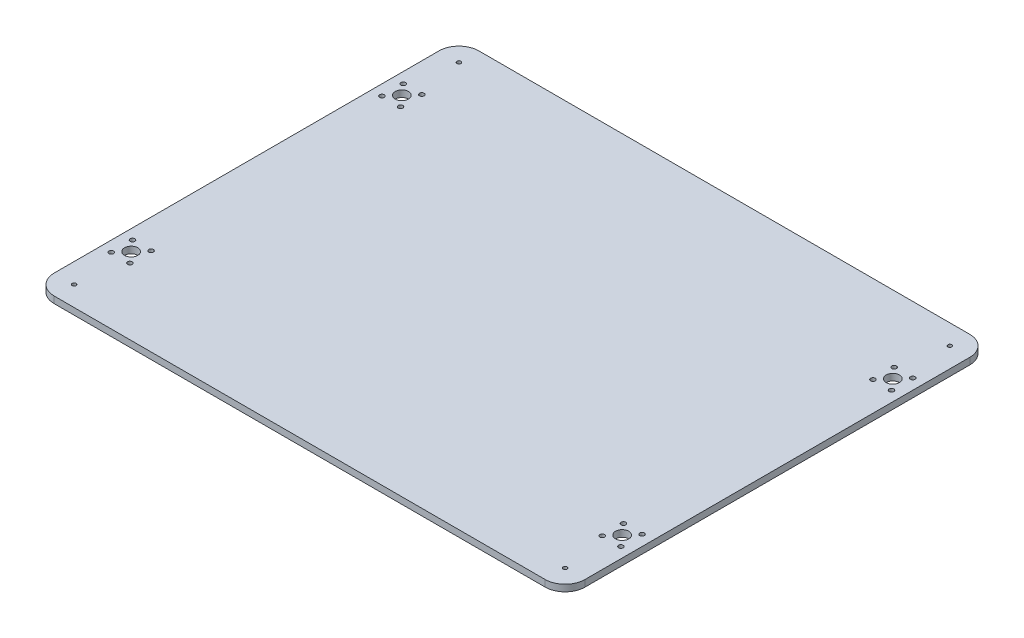
ISO-10303-21;
HEADER;
FILE_DESCRIPTION(('STEP AP214'),'2;1');
FILE_NAME('part.step','',(''),(''),'','','');
FILE_SCHEMA(('AUTOMOTIVE_DESIGN { 1 0 10303 214 1 1 1 1 }'));
ENDSEC;
DATA;
#1=APPLICATION_CONTEXT('core data for automotive mechanical design processes');
#2=APPLICATION_PROTOCOL_DEFINITION('international standard','automotive_design',2000,#1);
#3=PRODUCT_CONTEXT('',#1,'mechanical');
#4=PRODUCT('Part','Part','',(#3));
#5=PRODUCT_RELATED_PRODUCT_CATEGORY('part','',(#4));
#6=PRODUCT_DEFINITION_FORMATION('','',#4);
#7=PRODUCT_DEFINITION_CONTEXT('part definition',#1,'design');
#8=PRODUCT_DEFINITION('design','',#6,#7);
#9=PRODUCT_DEFINITION_SHAPE('','',#8);
#10=(LENGTH_UNIT() NAMED_UNIT(*) SI_UNIT(.MILLI.,.METRE.));
#11=(NAMED_UNIT(*) PLANE_ANGLE_UNIT() SI_UNIT($,.RADIAN.));
#12=(NAMED_UNIT(*) SI_UNIT($,.STERADIAN.) SOLID_ANGLE_UNIT());
#13=UNCERTAINTY_MEASURE_WITH_UNIT(LENGTH_MEASURE(1.E-05),#10,'distance_accuracy_value','');
#14=(GEOMETRIC_REPRESENTATION_CONTEXT(3) GLOBAL_UNCERTAINTY_ASSIGNED_CONTEXT((#13)) GLOBAL_UNIT_ASSIGNED_CONTEXT((#10,
#11,#12)) REPRESENTATION_CONTEXT('',''));
#15=CARTESIAN_POINT('',(0.,0.,0.));
#16=DIRECTION('',(0.,0.,1.));
#17=DIRECTION('',(1.,0.,0.));
#18=AXIS2_PLACEMENT_3D('',#15,#16,#17);
#19=CARTESIAN_POINT('',(0.,5.,0.));
#20=DIRECTION('',(0.,-1.,0.));
#21=DIRECTION('',(0.,0.,-1.));
#22=AXIS2_PLACEMENT_3D('',#19,#20,#21);
#23=PLANE('',#22);
#24=CARTESIAN_POINT('',(-185.,5.,-145.));
#25=DIRECTION('',(0.,1.,0.));
#26=DIRECTION('',(0.,0.,-1.));
#27=AXIS2_PLACEMENT_3D('',#24,#25,#26);
#28=CIRCLE('',#27,1.5);
#29=CARTESIAN_POINT('',(-185.,5.,-146.5));
#30=VERTEX_POINT('',#29);
#31=EDGE_CURVE('E385',#30,#30,#28,.T.);
#32=ORIENTED_EDGE('',*,*,#31,.F.);
#33=EDGE_LOOP('',(#32));
#34=FACE_BOUND('',#33,.T.);
#35=CARTESIAN_POINT('',(185.,5.,-145.));
#36=DIRECTION('',(0.,-1.,0.));
#37=DIRECTION('',(0.,0.,-1.));
#38=AXIS2_PLACEMENT_3D('',#35,#36,#37);
#39=CIRCLE('',#38,1.5);
#40=CARTESIAN_POINT('',(185.,5.,-146.5));
#41=VERTEX_POINT('',#40);
#42=EDGE_CURVE('E377',#41,#41,#39,.T.);
#43=ORIENTED_EDGE('',*,*,#42,.T.);
#44=EDGE_LOOP('',(#43));
#45=FACE_BOUND('',#44,.T.);
#46=CARTESIAN_POINT('',(-185.,5.,145.));
#47=DIRECTION('',(0.,-1.,0.));
#48=DIRECTION('',(0.,0.,1.));
#49=AXIS2_PLACEMENT_3D('',#46,#47,#48);
#50=CIRCLE('',#49,1.5);
#51=CARTESIAN_POINT('',(-185.,5.,146.5));
#52=VERTEX_POINT('',#51);
#53=EDGE_CURVE('E369',#52,#52,#50,.T.);
#54=ORIENTED_EDGE('',*,*,#53,.T.);
#55=EDGE_LOOP('',(#54));
#56=FACE_BOUND('',#55,.T.);
#57=CARTESIAN_POINT('',(185.,5.,145.));
#58=DIRECTION('',(0.,1.,0.));
#59=DIRECTION('',(0.,0.,1.));
#60=AXIS2_PLACEMENT_3D('',#57,#58,#59);
#61=CIRCLE('',#60,1.5);
#62=CARTESIAN_POINT('',(185.,5.,146.5));
#63=VERTEX_POINT('',#62);
#64=EDGE_CURVE('E361',#63,#63,#61,.T.);
#65=ORIENTED_EDGE('',*,*,#64,.F.);
#66=EDGE_LOOP('',(#65));
#67=FACE_BOUND('',#66,.T.);
#68=CARTESIAN_POINT('',(185.,5.,102.));
#69=DIRECTION('',(0.,1.,0.));
#70=DIRECTION('',(0.,0.,-1.));
#71=AXIS2_PLACEMENT_3D('',#68,#69,#70);
#72=CIRCLE('',#71,4.99999999999999);
#73=CARTESIAN_POINT('',(185.,5.,97.));
#74=VERTEX_POINT('',#73);
#75=EDGE_CURVE('E338',#74,#74,#72,.T.);
#76=ORIENTED_EDGE('',*,*,#75,.F.);
#77=EDGE_LOOP('',(#76));
#78=FACE_BOUND('',#77,.T.);
#79=CARTESIAN_POINT('',(178.,5.,110.));
#80=DIRECTION('',(0.,1.,0.));
#81=DIRECTION('',(0.,0.,-1.));
#82=AXIS2_PLACEMENT_3D('',#79,#80,#81);
#83=CIRCLE('',#82,1.75000000000001);
#84=CARTESIAN_POINT('',(178.,5.,108.25));
#85=VERTEX_POINT('',#84);
#86=EDGE_CURVE('E354',#85,#85,#83,.T.);
#87=ORIENTED_EDGE('',*,*,#86,.F.);
#88=EDGE_LOOP('',(#87));
#89=FACE_BOUND('',#88,.T.);
#90=CARTESIAN_POINT('',(192.,5.,110.));
#91=DIRECTION('',(0.,1.,0.));
#92=DIRECTION('',(0.,0.,-1.));
#93=AXIS2_PLACEMENT_3D('',#90,#91,#92);
#94=CIRCLE('',#93,1.75000000000001);
#95=CARTESIAN_POINT('',(192.,5.,108.25));
#96=VERTEX_POINT('',#95);
#97=EDGE_CURVE('E321',#96,#96,#94,.T.);
#98=ORIENTED_EDGE('',*,*,#97,.F.);
#99=EDGE_LOOP('',(#98));
#100=FACE_BOUND('',#99,.T.);
#101=CARTESIAN_POINT('',(178.,5.,-94.0000000000001));
#102=DIRECTION('',(0.,-1.,0.));
#103=DIRECTION('',(0.,0.,1.));
#104=AXIS2_PLACEMENT_3D('',#101,#102,#103);
#105=CIRCLE('',#104,1.75000000000001);
#106=CARTESIAN_POINT('',(178.,5.,-92.25));
#107=VERTEX_POINT('',#106);
#108=EDGE_CURVE('E306',#107,#107,#105,.F.);
#109=ORIENTED_EDGE('',*,*,#108,.F.);
#110=EDGE_LOOP('',(#109));
#111=FACE_BOUND('',#110,.T.);
#112=CARTESIAN_POINT('',(178.,5.,-110.));
#113=DIRECTION('',(0.,-1.,0.));
#114=DIRECTION('',(0.,0.,1.));
#115=AXIS2_PLACEMENT_3D('',#112,#113,#114);
#116=CIRCLE('',#115,1.75000000000001);
#117=CARTESIAN_POINT('',(178.,5.,-108.25));
#118=VERTEX_POINT('',#117);
#119=EDGE_CURVE('E314',#118,#118,#116,.T.);
#120=ORIENTED_EDGE('',*,*,#119,.T.);
#121=EDGE_LOOP('',(#120));
#122=FACE_BOUND('',#121,.T.);
#123=CARTESIAN_POINT('',(192.,5.,-110.));
#124=DIRECTION('',(0.,-1.,0.));
#125=DIRECTION('',(0.,0.,1.));
#126=AXIS2_PLACEMENT_3D('',#123,#124,#125);
#127=CIRCLE('',#126,1.75000000000001);
#128=CARTESIAN_POINT('',(192.,5.,-108.25));
#129=VERTEX_POINT('',#128);
#130=EDGE_CURVE('E281',#129,#129,#127,.T.);
#131=ORIENTED_EDGE('',*,*,#130,.T.);
#132=EDGE_LOOP('',(#131));
#133=FACE_BOUND('',#132,.T.);
#134=CARTESIAN_POINT('',(-178.,5.,94.0000000000001));
#135=DIRECTION('',(0.,-1.,0.));
#136=DIRECTION('',(0.,0.,-1.));
#137=AXIS2_PLACEMENT_3D('',#134,#135,#136);
#138=CIRCLE('',#137,1.75000000000001);
#139=CARTESIAN_POINT('',(-178.,5.,92.25));
#140=VERTEX_POINT('',#139);
#141=EDGE_CURVE('E266',#140,#140,#138,.F.);
#142=ORIENTED_EDGE('',*,*,#141,.F.);
#143=EDGE_LOOP('',(#142));
#144=FACE_BOUND('',#143,.T.);
#145=CARTESIAN_POINT('',(-178.,5.,110.));
#146=DIRECTION('',(0.,-1.,0.));
#147=DIRECTION('',(0.,0.,-1.));
#148=AXIS2_PLACEMENT_3D('',#145,#146,#147);
#149=CIRCLE('',#148,1.75000000000001);
#150=CARTESIAN_POINT('',(-178.,5.,108.25));
#151=VERTEX_POINT('',#150);
#152=EDGE_CURVE('E274',#151,#151,#149,.T.);
#153=ORIENTED_EDGE('',*,*,#152,.T.);
#154=EDGE_LOOP('',(#153));
#155=FACE_BOUND('',#154,.T.);
#156=CARTESIAN_POINT('',(-192.,5.,110.));
#157=DIRECTION('',(0.,-1.,0.));
#158=DIRECTION('',(0.,0.,-1.));
#159=AXIS2_PLACEMENT_3D('',#156,#157,#158);
#160=CIRCLE('',#159,1.75000000000001);
#161=CARTESIAN_POINT('',(-192.,5.,108.25));
#162=VERTEX_POINT('',#161);
#163=EDGE_CURVE('E241',#162,#162,#160,.T.);
#164=ORIENTED_EDGE('',*,*,#163,.T.);
#165=EDGE_LOOP('',(#164));
#166=FACE_BOUND('',#165,.T.);
#167=CARTESIAN_POINT('',(-185.,5.,-102.));
#168=DIRECTION('',(0.,1.,0.));
#169=DIRECTION('',(0.,0.,1.));
#170=AXIS2_PLACEMENT_3D('',#167,#168,#169);
#171=CIRCLE('',#170,4.99999999999999);
#172=CARTESIAN_POINT('',(-185.,5.,-97.));
#173=VERTEX_POINT('',#172);
#174=EDGE_CURVE('E218',#173,#173,#171,.T.);
#175=ORIENTED_EDGE('',*,*,#174,.F.);
#176=EDGE_LOOP('',(#175));
#177=FACE_BOUND('',#176,.T.);
#178=CARTESIAN_POINT('',(-178.,5.,-110.));
#179=DIRECTION('',(0.,1.,0.));
#180=DIRECTION('',(0.,0.,1.));
#181=AXIS2_PLACEMENT_3D('',#178,#179,#180);
#182=CIRCLE('',#181,1.75000000000001);
#183=CARTESIAN_POINT('',(-178.,5.,-108.25));
#184=VERTEX_POINT('',#183);
#185=EDGE_CURVE('E234',#184,#184,#182,.T.);
#186=ORIENTED_EDGE('',*,*,#185,.F.);
#187=EDGE_LOOP('',(#186));
#188=FACE_BOUND('',#187,.T.);
#189=CARTESIAN_POINT('',(-192.,5.,-110.));
#190=DIRECTION('',(0.,1.,0.));
#191=DIRECTION('',(0.,0.,1.));
#192=AXIS2_PLACEMENT_3D('',#189,#190,#191);
#193=CIRCLE('',#192,1.75000000000001);
#194=CARTESIAN_POINT('',(-192.,5.,-108.25));
#195=VERTEX_POINT('',#194);
#196=EDGE_CURVE('E151',#195,#195,#193,.T.);
#197=ORIENTED_EDGE('',*,*,#196,.F.);
#198=EDGE_LOOP('',(#197));
#199=FACE_BOUND('',#198,.T.);
#200=DIRECTION('',(0.,0.,1.));
#201=VECTOR('',#200,1.);
#202=CARTESIAN_POINT('',(-200.,5.,0.));
#203=LINE('',#202,#201);
#204=CARTESIAN_POINT('',(-200.,5.,-145.));
#205=VERTEX_POINT('',#204);
#206=CARTESIAN_POINT('',(-200.,5.,145.));
#207=VERTEX_POINT('',#206);
#208=EDGE_CURVE('E154',#205,#207,#203,.T.);
#209=ORIENTED_EDGE('',*,*,#208,.T.);
#210=CARTESIAN_POINT('',(-185.,5.,145.));
#211=DIRECTION('',(0.,-1.,0.));
#212=DIRECTION('',(0.,0.,-1.));
#213=AXIS2_PLACEMENT_3D('',#210,#211,#212);
#214=CIRCLE('',#213,15.);
#215=CARTESIAN_POINT('',(-185.,5.,160.));
#216=VERTEX_POINT('',#215);
#217=EDGE_CURVE('E184',#207,#216,#214,.F.);
#218=ORIENTED_EDGE('',*,*,#217,.T.);
#219=DIRECTION('',(1.,0.,0.));
#220=VECTOR('',#219,1.);
#221=CARTESIAN_POINT('',(-200.,5.,160.));
#222=LINE('',#221,#220);
#223=CARTESIAN_POINT('',(185.,5.,160.));
#224=VERTEX_POINT('',#223);
#225=EDGE_CURVE('E133',#216,#224,#222,.T.);
#226=ORIENTED_EDGE('',*,*,#225,.T.);
#227=CARTESIAN_POINT('',(185.,5.,145.));
#228=DIRECTION('',(0.,-1.,0.));
#229=DIRECTION('',(0.,0.,-1.));
#230=AXIS2_PLACEMENT_3D('',#227,#228,#229);
#231=CIRCLE('',#230,15.);
#232=CARTESIAN_POINT('',(200.,5.,145.));
#233=VERTEX_POINT('',#232);
#234=EDGE_CURVE('E181',#224,#233,#231,.F.);
#235=ORIENTED_EDGE('',*,*,#234,.T.);
#236=DIRECTION('',(0.,0.,-1.));
#237=VECTOR('',#236,1.);
#238=CARTESIAN_POINT('',(200.,5.,0.));
#239=LINE('',#238,#237);
#240=CARTESIAN_POINT('',(200.,5.,-145.));
#241=VERTEX_POINT('',#240);
#242=EDGE_CURVE('E199',#233,#241,#239,.T.);
#243=ORIENTED_EDGE('',*,*,#242,.T.);
#244=CARTESIAN_POINT('',(185.,5.,-145.));
#245=DIRECTION('',(0.,-1.,0.));
#246=DIRECTION('',(0.,0.,-1.));
#247=AXIS2_PLACEMENT_3D('',#244,#245,#246);
#248=CIRCLE('',#247,15.);
#249=CARTESIAN_POINT('',(185.,5.,-160.));
#250=VERTEX_POINT('',#249);
#251=EDGE_CURVE('E67',#241,#250,#248,.F.);
#252=ORIENTED_EDGE('',*,*,#251,.T.);
#253=DIRECTION('',(-1.,0.,0.));
#254=VECTOR('',#253,1.);
#255=CARTESIAN_POINT('',(-200.,5.,-160.));
#256=LINE('',#255,#254);
#257=CARTESIAN_POINT('',(-185.,5.,-160.));
#258=VERTEX_POINT('',#257);
#259=EDGE_CURVE('E197',#250,#258,#256,.T.);
#260=ORIENTED_EDGE('',*,*,#259,.T.);
#261=CARTESIAN_POINT('',(-185.,5.,-145.));
#262=DIRECTION('',(0.,-1.,0.));
#263=DIRECTION('',(0.,0.,-1.));
#264=AXIS2_PLACEMENT_3D('',#261,#262,#263);
#265=CIRCLE('',#264,15.);
#266=EDGE_CURVE('E176',#258,#205,#265,.F.);
#267=ORIENTED_EDGE('',*,*,#266,.T.);
#268=EDGE_LOOP('',(#209,#218,#226,#235,#243,#252,#260,#267));
#269=FACE_BOUND('',#268,.T.);
#270=CARTESIAN_POINT('',(-178.,5.,-94.0000000000001));
#271=DIRECTION('',(0.,1.,0.));
#272=DIRECTION('',(0.,0.,1.));
#273=AXIS2_PLACEMENT_3D('',#270,#271,#272);
#274=CIRCLE('',#273,1.75000000000001);
#275=CARTESIAN_POINT('',(-178.,5.,-92.25));
#276=VERTEX_POINT('',#275);
#277=EDGE_CURVE('E226',#276,#276,#274,.F.);
#278=ORIENTED_EDGE('',*,*,#277,.T.);
#279=EDGE_LOOP('',(#278));
#280=FACE_BOUND('',#279,.T.);
#281=CARTESIAN_POINT('',(-192.,5.,-94.));
#282=DIRECTION('',(0.,1.,0.));
#283=DIRECTION('',(0.,0.,1.));
#284=AXIS2_PLACEMENT_3D('',#281,#282,#283);
#285=CIRCLE('',#284,1.75000000000001);
#286=CARTESIAN_POINT('',(-192.,5.,-92.25));
#287=VERTEX_POINT('',#286);
#288=EDGE_CURVE('E209',#287,#287,#285,.F.);
#289=ORIENTED_EDGE('',*,*,#288,.T.);
#290=EDGE_LOOP('',(#289));
#291=FACE_BOUND('',#290,.T.);
#292=CARTESIAN_POINT('',(-185.,5.,102.));
#293=DIRECTION('',(0.,-1.,0.));
#294=DIRECTION('',(0.,0.,-1.));
#295=AXIS2_PLACEMENT_3D('',#292,#293,#294);
#296=CIRCLE('',#295,4.99999999999999);
#297=CARTESIAN_POINT('',(-185.,5.,97.));
#298=VERTEX_POINT('',#297);
#299=EDGE_CURVE('E258',#298,#298,#296,.T.);
#300=ORIENTED_EDGE('',*,*,#299,.T.);
#301=EDGE_LOOP('',(#300));
#302=FACE_BOUND('',#301,.T.);
#303=CARTESIAN_POINT('',(-192.,5.,94.));
#304=DIRECTION('',(0.,-1.,0.));
#305=DIRECTION('',(0.,0.,-1.));
#306=AXIS2_PLACEMENT_3D('',#303,#304,#305);
#307=CIRCLE('',#306,1.75000000000001);
#308=CARTESIAN_POINT('',(-192.,5.,92.25));
#309=VERTEX_POINT('',#308);
#310=EDGE_CURVE('E249',#309,#309,#307,.F.);
#311=ORIENTED_EDGE('',*,*,#310,.F.);
#312=EDGE_LOOP('',(#311));
#313=FACE_BOUND('',#312,.T.);
#314=CARTESIAN_POINT('',(185.,5.,-102.));
#315=DIRECTION('',(0.,-1.,0.));
#316=DIRECTION('',(0.,0.,1.));
#317=AXIS2_PLACEMENT_3D('',#314,#315,#316);
#318=CIRCLE('',#317,4.99999999999999);
#319=CARTESIAN_POINT('',(185.,5.,-97.));
#320=VERTEX_POINT('',#319);
#321=EDGE_CURVE('E298',#320,#320,#318,.T.);
#322=ORIENTED_EDGE('',*,*,#321,.T.);
#323=EDGE_LOOP('',(#322));
#324=FACE_BOUND('',#323,.T.);
#325=CARTESIAN_POINT('',(192.,5.,-94.));
#326=DIRECTION('',(0.,-1.,0.));
#327=DIRECTION('',(0.,0.,1.));
#328=AXIS2_PLACEMENT_3D('',#325,#326,#327);
#329=CIRCLE('',#328,1.75000000000001);
#330=CARTESIAN_POINT('',(192.,5.,-92.25));
#331=VERTEX_POINT('',#330);
#332=EDGE_CURVE('E289',#331,#331,#329,.F.);
#333=ORIENTED_EDGE('',*,*,#332,.F.);
#334=EDGE_LOOP('',(#333));
#335=FACE_BOUND('',#334,.T.);
#336=CARTESIAN_POINT('',(178.,5.,94.0000000000001));
#337=DIRECTION('',(0.,1.,0.));
#338=DIRECTION('',(0.,0.,-1.));
#339=AXIS2_PLACEMENT_3D('',#336,#337,#338);
#340=CIRCLE('',#339,1.75000000000001);
#341=CARTESIAN_POINT('',(178.,5.,92.25));
#342=VERTEX_POINT('',#341);
#343=EDGE_CURVE('E346',#342,#342,#340,.F.);
#344=ORIENTED_EDGE('',*,*,#343,.T.);
#345=EDGE_LOOP('',(#344));
#346=FACE_BOUND('',#345,.T.);
#347=CARTESIAN_POINT('',(192.,5.,94.));
#348=DIRECTION('',(0.,1.,0.));
#349=DIRECTION('',(0.,0.,-1.));
#350=AXIS2_PLACEMENT_3D('',#347,#348,#349);
#351=CIRCLE('',#350,1.75000000000001);
#352=CARTESIAN_POINT('',(192.,5.,92.25));
#353=VERTEX_POINT('',#352);
#354=EDGE_CURVE('E329',#353,#353,#351,.F.);
#355=ORIENTED_EDGE('',*,*,#354,.T.);
#356=EDGE_LOOP('',(#355));
#357=FACE_BOUND('',#356,.T.);
#358=ADVANCED_FACE('F45',(#34,#45,#56,#67,#78,#89,#100,#111,#122,#133,#144,#155,#166,#177,#188,
#199,#269,#280,#291,#302,#313,#324,#335,#346,#357),#23,.F.);
#359=CARTESIAN_POINT('',(0.,0.,0.));
#360=DIRECTION('',(0.,-1.,0.));
#361=DIRECTION('',(0.,0.,-1.));
#362=AXIS2_PLACEMENT_3D('',#359,#360,#361);
#363=PLANE('',#362);
#364=CARTESIAN_POINT('',(-185.,0.,-145.));
#365=DIRECTION('',(0.,1.,0.));
#366=DIRECTION('',(0.,0.,-1.));
#367=AXIS2_PLACEMENT_3D('',#364,#365,#366);
#368=CIRCLE('',#367,1.5);
#369=CARTESIAN_POINT('',(-185.,0.,-146.5));
#370=VERTEX_POINT('',#369);
#371=EDGE_CURVE('E381',#370,#370,#368,.T.);
#372=ORIENTED_EDGE('',*,*,#371,.T.);
#373=EDGE_LOOP('',(#372));
#374=FACE_BOUND('',#373,.T.);
#375=CARTESIAN_POINT('',(185.,0.,-145.));
#376=DIRECTION('',(0.,-1.,0.));
#377=DIRECTION('',(0.,0.,-1.));
#378=AXIS2_PLACEMENT_3D('',#375,#376,#377);
#379=CIRCLE('',#378,1.5);
#380=CARTESIAN_POINT('',(185.,0.,-146.5));
#381=VERTEX_POINT('',#380);
#382=EDGE_CURVE('E373',#381,#381,#379,.T.);
#383=ORIENTED_EDGE('',*,*,#382,.F.);
#384=EDGE_LOOP('',(#383));
#385=FACE_BOUND('',#384,.T.);
#386=CARTESIAN_POINT('',(-185.,0.,145.));
#387=DIRECTION('',(0.,-1.,0.));
#388=DIRECTION('',(0.,0.,1.));
#389=AXIS2_PLACEMENT_3D('',#386,#387,#388);
#390=CIRCLE('',#389,1.5);
#391=CARTESIAN_POINT('',(-185.,0.,146.5));
#392=VERTEX_POINT('',#391);
#393=EDGE_CURVE('E365',#392,#392,#390,.T.);
#394=ORIENTED_EDGE('',*,*,#393,.F.);
#395=EDGE_LOOP('',(#394));
#396=FACE_BOUND('',#395,.T.);
#397=CARTESIAN_POINT('',(185.,0.,145.));
#398=DIRECTION('',(0.,1.,0.));
#399=DIRECTION('',(0.,0.,1.));
#400=AXIS2_PLACEMENT_3D('',#397,#398,#399);
#401=CIRCLE('',#400,1.5);
#402=CARTESIAN_POINT('',(185.,0.,146.5));
#403=VERTEX_POINT('',#402);
#404=EDGE_CURVE('E334',#403,#403,#401,.T.);
#405=ORIENTED_EDGE('',*,*,#404,.T.);
#406=EDGE_LOOP('',(#405));
#407=FACE_BOUND('',#406,.T.);
#408=CARTESIAN_POINT('',(178.,0.,94.0000000000001));
#409=DIRECTION('',(0.,1.,0.));
#410=DIRECTION('',(0.,0.,-1.));
#411=AXIS2_PLACEMENT_3D('',#408,#409,#410);
#412=CIRCLE('',#411,1.75000000000001);
#413=CARTESIAN_POINT('',(178.,0.,92.25));
#414=VERTEX_POINT('',#413);
#415=EDGE_CURVE('E350',#414,#414,#412,.F.);
#416=ORIENTED_EDGE('',*,*,#415,.F.);
#417=EDGE_LOOP('',(#416));
#418=FACE_BOUND('',#417,.T.);
#419=CARTESIAN_POINT('',(178.,0.,110.));
#420=DIRECTION('',(0.,1.,0.));
#421=DIRECTION('',(0.,0.,-1.));
#422=AXIS2_PLACEMENT_3D('',#419,#420,#421);
#423=CIRCLE('',#422,1.75000000000001);
#424=CARTESIAN_POINT('',(178.,0.,108.25));
#425=VERTEX_POINT('',#424);
#426=EDGE_CURVE('E325',#425,#425,#423,.T.);
#427=ORIENTED_EDGE('',*,*,#426,.T.);
#428=EDGE_LOOP('',(#427));
#429=FACE_BOUND('',#428,.T.);
#430=CARTESIAN_POINT('',(192.,0.,110.));
#431=DIRECTION('',(0.,1.,0.));
#432=DIRECTION('',(0.,0.,-1.));
#433=AXIS2_PLACEMENT_3D('',#430,#431,#432);
#434=CIRCLE('',#433,1.75000000000001);
#435=CARTESIAN_POINT('',(192.,0.,108.25));
#436=VERTEX_POINT('',#435);
#437=EDGE_CURVE('E294',#436,#436,#434,.T.);
#438=ORIENTED_EDGE('',*,*,#437,.T.);
#439=EDGE_LOOP('',(#438));
#440=FACE_BOUND('',#439,.T.);
#441=CARTESIAN_POINT('',(185.,0.,-102.));
#442=DIRECTION('',(0.,-1.,0.));
#443=DIRECTION('',(0.,0.,1.));
#444=AXIS2_PLACEMENT_3D('',#441,#442,#443);
#445=CIRCLE('',#444,4.99999999999999);
#446=CARTESIAN_POINT('',(185.,0.,-97.));
#447=VERTEX_POINT('',#446);
#448=EDGE_CURVE('E302',#447,#447,#445,.T.);
#449=ORIENTED_EDGE('',*,*,#448,.F.);
#450=EDGE_LOOP('',(#449));
#451=FACE_BOUND('',#450,.T.);
#452=CARTESIAN_POINT('',(178.,0.,-110.));
#453=DIRECTION('',(0.,-1.,0.));
#454=DIRECTION('',(0.,0.,1.));
#455=AXIS2_PLACEMENT_3D('',#452,#453,#454);
#456=CIRCLE('',#455,1.75000000000001);
#457=CARTESIAN_POINT('',(178.,0.,-108.25));
#458=VERTEX_POINT('',#457);
#459=EDGE_CURVE('E285',#458,#458,#456,.T.);
#460=ORIENTED_EDGE('',*,*,#459,.F.);
#461=EDGE_LOOP('',(#460));
#462=FACE_BOUND('',#461,.T.);
#463=CARTESIAN_POINT('',(192.,0.,-110.));
#464=DIRECTION('',(0.,-1.,0.));
#465=DIRECTION('',(0.,0.,1.));
#466=AXIS2_PLACEMENT_3D('',#463,#464,#465);
#467=CIRCLE('',#466,1.75000000000001);
#468=CARTESIAN_POINT('',(192.,0.,-108.25));
#469=VERTEX_POINT('',#468);
#470=EDGE_CURVE('E254',#469,#469,#467,.T.);
#471=ORIENTED_EDGE('',*,*,#470,.F.);
#472=EDGE_LOOP('',(#471));
#473=FACE_BOUND('',#472,.T.);
#474=CARTESIAN_POINT('',(-185.,0.,102.));
#475=DIRECTION('',(0.,-1.,0.));
#476=DIRECTION('',(0.,0.,-1.));
#477=AXIS2_PLACEMENT_3D('',#474,#475,#476);
#478=CIRCLE('',#477,4.99999999999999);
#479=CARTESIAN_POINT('',(-185.,0.,97.));
#480=VERTEX_POINT('',#479);
#481=EDGE_CURVE('E262',#480,#480,#478,.T.);
#482=ORIENTED_EDGE('',*,*,#481,.F.);
#483=EDGE_LOOP('',(#482));
#484=FACE_BOUND('',#483,.T.);
#485=CARTESIAN_POINT('',(-178.,0.,110.));
#486=DIRECTION('',(0.,-1.,0.));
#487=DIRECTION('',(0.,0.,-1.));
#488=AXIS2_PLACEMENT_3D('',#485,#486,#487);
#489=CIRCLE('',#488,1.75000000000001);
#490=CARTESIAN_POINT('',(-178.,0.,108.25));
#491=VERTEX_POINT('',#490);
#492=EDGE_CURVE('E245',#491,#491,#489,.T.);
#493=ORIENTED_EDGE('',*,*,#492,.F.);
#494=EDGE_LOOP('',(#493));
#495=FACE_BOUND('',#494,.T.);
#496=CARTESIAN_POINT('',(-192.,0.,110.));
#497=DIRECTION('',(0.,-1.,0.));
#498=DIRECTION('',(0.,0.,-1.));
#499=AXIS2_PLACEMENT_3D('',#496,#497,#498);
#500=CIRCLE('',#499,1.75000000000001);
#501=CARTESIAN_POINT('',(-192.,0.,108.25));
#502=VERTEX_POINT('',#501);
#503=EDGE_CURVE('E214',#502,#502,#500,.T.);
#504=ORIENTED_EDGE('',*,*,#503,.F.);
#505=EDGE_LOOP('',(#504));
#506=FACE_BOUND('',#505,.T.);
#507=CARTESIAN_POINT('',(-178.,0.,-94.0000000000001));
#508=DIRECTION('',(0.,1.,0.));
#509=DIRECTION('',(0.,0.,1.));
#510=AXIS2_PLACEMENT_3D('',#507,#508,#509);
#511=CIRCLE('',#510,1.75000000000001);
#512=CARTESIAN_POINT('',(-178.,0.,-92.25));
#513=VERTEX_POINT('',#512);
#514=EDGE_CURVE('E230',#513,#513,#511,.F.);
#515=ORIENTED_EDGE('',*,*,#514,.F.);
#516=EDGE_LOOP('',(#515));
#517=FACE_BOUND('',#516,.T.);
#518=CARTESIAN_POINT('',(-178.,0.,-110.));
#519=DIRECTION('',(0.,1.,0.));
#520=DIRECTION('',(0.,0.,1.));
#521=AXIS2_PLACEMENT_3D('',#518,#519,#520);
#522=CIRCLE('',#521,1.75000000000001);
#523=CARTESIAN_POINT('',(-178.,0.,-108.25));
#524=VERTEX_POINT('',#523);
#525=EDGE_CURVE('E207',#524,#524,#522,.T.);
#526=ORIENTED_EDGE('',*,*,#525,.T.);
#527=EDGE_LOOP('',(#526));
#528=FACE_BOUND('',#527,.T.);
#529=CARTESIAN_POINT('',(-192.,0.,-110.));
#530=DIRECTION('',(0.,1.,0.));
#531=DIRECTION('',(0.,0.,1.));
#532=AXIS2_PLACEMENT_3D('',#529,#530,#531);
#533=CIRCLE('',#532,1.75000000000001);
#534=CARTESIAN_POINT('',(-192.,0.,-108.25));
#535=VERTEX_POINT('',#534);
#536=EDGE_CURVE('E143',#535,#535,#533,.T.);
#537=ORIENTED_EDGE('',*,*,#536,.T.);
#538=EDGE_LOOP('',(#537));
#539=FACE_BOUND('',#538,.T.);
#540=DIRECTION('',(1.,0.,0.));
#541=VECTOR('',#540,1.);
#542=CARTESIAN_POINT('',(-200.,0.,160.));
#543=LINE('',#542,#541);
#544=CARTESIAN_POINT('',(-185.,0.,160.));
#545=VERTEX_POINT('',#544);
#546=CARTESIAN_POINT('',(185.,0.,160.));
#547=VERTEX_POINT('',#546);
#548=EDGE_CURVE('E130',#545,#547,#543,.T.);
#549=ORIENTED_EDGE('',*,*,#548,.F.);
#550=CARTESIAN_POINT('',(-185.,0.,145.));
#551=DIRECTION('',(0.,-1.,0.));
#552=DIRECTION('',(0.,0.,-1.));
#553=AXIS2_PLACEMENT_3D('',#550,#551,#552);
#554=CIRCLE('',#553,15.);
#555=CARTESIAN_POINT('',(-200.,0.,145.));
#556=VERTEX_POINT('',#555);
#557=EDGE_CURVE('E112',#545,#556,#554,.T.);
#558=ORIENTED_EDGE('',*,*,#557,.T.);
#559=DIRECTION('',(0.,0.,1.));
#560=VECTOR('',#559,1.);
#561=CARTESIAN_POINT('',(-200.,0.,0.));
#562=LINE('',#561,#560);
#563=CARTESIAN_POINT('',(-200.,0.,-145.));
#564=VERTEX_POINT('',#563);
#565=EDGE_CURVE('E159',#564,#556,#562,.T.);
#566=ORIENTED_EDGE('',*,*,#565,.F.);
#567=CARTESIAN_POINT('',(-185.,0.,-145.));
#568=DIRECTION('',(0.,-1.,0.));
#569=DIRECTION('',(0.,0.,-1.));
#570=AXIS2_PLACEMENT_3D('',#567,#568,#569);
#571=CIRCLE('',#570,15.);
#572=CARTESIAN_POINT('',(-185.,0.,-160.));
#573=VERTEX_POINT('',#572);
#574=EDGE_CURVE('E135',#564,#573,#571,.T.);
#575=ORIENTED_EDGE('',*,*,#574,.T.);
#576=DIRECTION('',(-1.,0.,0.));
#577=VECTOR('',#576,1.);
#578=CARTESIAN_POINT('',(-200.,0.,-160.));
#579=LINE('',#578,#577);
#580=CARTESIAN_POINT('',(185.,0.,-160.));
#581=VERTEX_POINT('',#580);
#582=EDGE_CURVE('E148',#581,#573,#579,.T.);
#583=ORIENTED_EDGE('',*,*,#582,.F.);
#584=CARTESIAN_POINT('',(185.,0.,-145.));
#585=DIRECTION('',(0.,-1.,0.));
#586=DIRECTION('',(0.,0.,-1.));
#587=AXIS2_PLACEMENT_3D('',#584,#585,#586);
#588=CIRCLE('',#587,15.);
#589=CARTESIAN_POINT('',(200.,0.,-145.));
#590=VERTEX_POINT('',#589);
#591=EDGE_CURVE('E166',#581,#590,#588,.T.);
#592=ORIENTED_EDGE('',*,*,#591,.T.);
#593=DIRECTION('',(0.,0.,-1.));
#594=VECTOR('',#593,1.);
#595=CARTESIAN_POINT('',(200.,0.,0.));
#596=LINE('',#595,#594);
#597=CARTESIAN_POINT('',(200.,0.,145.));
#598=VERTEX_POINT('',#597);
#599=EDGE_CURVE('E142',#598,#590,#596,.T.);
#600=ORIENTED_EDGE('',*,*,#599,.F.);
#601=CARTESIAN_POINT('',(185.,0.,145.));
#602=DIRECTION('',(0.,-1.,0.));
#603=DIRECTION('',(0.,0.,-1.));
#604=AXIS2_PLACEMENT_3D('',#601,#602,#603);
#605=CIRCLE('',#604,15.);
#606=EDGE_CURVE('E124',#598,#547,#605,.T.);
#607=ORIENTED_EDGE('',*,*,#606,.T.);
#608=EDGE_LOOP('',(#549,#558,#566,#575,#583,#592,#600,#607));
#609=FACE_BOUND('',#608,.T.);
#610=CARTESIAN_POINT('',(-185.,0.,-102.));
#611=DIRECTION('',(0.,1.,0.));
#612=DIRECTION('',(0.,0.,1.));
#613=AXIS2_PLACEMENT_3D('',#610,#611,#612);
#614=CIRCLE('',#613,4.99999999999999);
#615=CARTESIAN_POINT('',(-185.,0.,-97.));
#616=VERTEX_POINT('',#615);
#617=EDGE_CURVE('E222',#616,#616,#614,.T.);
#618=ORIENTED_EDGE('',*,*,#617,.T.);
#619=EDGE_LOOP('',(#618));
#620=FACE_BOUND('',#619,.T.);
#621=CARTESIAN_POINT('',(-192.,0.,-94.));
#622=DIRECTION('',(0.,1.,0.));
#623=DIRECTION('',(0.,0.,1.));
#624=AXIS2_PLACEMENT_3D('',#621,#622,#623);
#625=CIRCLE('',#624,1.75000000000001);
#626=CARTESIAN_POINT('',(-192.,0.,-92.25));
#627=VERTEX_POINT('',#626);
#628=EDGE_CURVE('E213',#627,#627,#625,.F.);
#629=ORIENTED_EDGE('',*,*,#628,.F.);
#630=EDGE_LOOP('',(#629));
#631=FACE_BOUND('',#630,.T.);
#632=CARTESIAN_POINT('',(-178.,0.,94.0000000000001));
#633=DIRECTION('',(0.,-1.,0.));
#634=DIRECTION('',(0.,0.,-1.));
#635=AXIS2_PLACEMENT_3D('',#632,#633,#634);
#636=CIRCLE('',#635,1.75000000000001);
#637=CARTESIAN_POINT('',(-178.,0.,92.25));
#638=VERTEX_POINT('',#637);
#639=EDGE_CURVE('E270',#638,#638,#636,.F.);
#640=ORIENTED_EDGE('',*,*,#639,.T.);
#641=EDGE_LOOP('',(#640));
#642=FACE_BOUND('',#641,.T.);
#643=CARTESIAN_POINT('',(-192.,0.,94.));
#644=DIRECTION('',(0.,-1.,0.));
#645=DIRECTION('',(0.,0.,-1.));
#646=AXIS2_PLACEMENT_3D('',#643,#644,#645);
#647=CIRCLE('',#646,1.75000000000001);
#648=CARTESIAN_POINT('',(-192.,0.,92.25));
#649=VERTEX_POINT('',#648);
#650=EDGE_CURVE('E253',#649,#649,#647,.F.);
#651=ORIENTED_EDGE('',*,*,#650,.T.);
#652=EDGE_LOOP('',(#651));
#653=FACE_BOUND('',#652,.T.);
#654=CARTESIAN_POINT('',(178.,0.,-94.0000000000001));
#655=DIRECTION('',(0.,-1.,0.));
#656=DIRECTION('',(0.,0.,1.));
#657=AXIS2_PLACEMENT_3D('',#654,#655,#656);
#658=CIRCLE('',#657,1.75000000000001);
#659=CARTESIAN_POINT('',(178.,0.,-92.25));
#660=VERTEX_POINT('',#659);
#661=EDGE_CURVE('E310',#660,#660,#658,.F.);
#662=ORIENTED_EDGE('',*,*,#661,.T.);
#663=EDGE_LOOP('',(#662));
#664=FACE_BOUND('',#663,.T.);
#665=CARTESIAN_POINT('',(192.,0.,-94.));
#666=DIRECTION('',(0.,-1.,0.));
#667=DIRECTION('',(0.,0.,1.));
#668=AXIS2_PLACEMENT_3D('',#665,#666,#667);
#669=CIRCLE('',#668,1.75000000000001);
#670=CARTESIAN_POINT('',(192.,0.,-92.25));
#671=VERTEX_POINT('',#670);
#672=EDGE_CURVE('E293',#671,#671,#669,.F.);
#673=ORIENTED_EDGE('',*,*,#672,.T.);
#674=EDGE_LOOP('',(#673));
#675=FACE_BOUND('',#674,.T.);
#676=CARTESIAN_POINT('',(185.,0.,102.));
#677=DIRECTION('',(0.,1.,0.));
#678=DIRECTION('',(0.,0.,-1.));
#679=AXIS2_PLACEMENT_3D('',#676,#677,#678);
#680=CIRCLE('',#679,4.99999999999999);
#681=CARTESIAN_POINT('',(185.,0.,97.));
#682=VERTEX_POINT('',#681);
#683=EDGE_CURVE('E342',#682,#682,#680,.T.);
#684=ORIENTED_EDGE('',*,*,#683,.T.);
#685=EDGE_LOOP('',(#684));
#686=FACE_BOUND('',#685,.T.);
#687=CARTESIAN_POINT('',(192.,0.,94.));
#688=DIRECTION('',(0.,1.,0.));
#689=DIRECTION('',(0.,0.,-1.));
#690=AXIS2_PLACEMENT_3D('',#687,#688,#689);
#691=CIRCLE('',#690,1.75000000000001);
#692=CARTESIAN_POINT('',(192.,0.,92.25));
#693=VERTEX_POINT('',#692);
#694=EDGE_CURVE('E333',#693,#693,#691,.F.);
#695=ORIENTED_EDGE('',*,*,#694,.F.);
#696=EDGE_LOOP('',(#695));
#697=FACE_BOUND('',#696,.T.);
#698=ADVANCED_FACE('F138',(#374,#385,#396,#407,#418,#429,#440,#451,#462,#473,#484,#495,#506,
#517,#528,#539,#609,#620,#631,#642,#653,#664,#675,#686,#697),#363,.T.);
#699=CARTESIAN_POINT('',(-200.,5.,160.));
#700=DIRECTION('',(0.,0.,-1.));
#701=DIRECTION('',(-1.,0.,0.));
#702=AXIS2_PLACEMENT_3D('',#699,#700,#701);
#703=PLANE('',#702);
#704=ORIENTED_EDGE('',*,*,#225,.F.);
#705=DIRECTION('',(0.,-1.,0.));
#706=VECTOR('',#705,1.);
#707=CARTESIAN_POINT('',(-185.,5.,160.));
#708=LINE('',#707,#706);
#709=EDGE_CURVE('E116',#216,#545,#708,.T.);
#710=ORIENTED_EDGE('',*,*,#709,.T.);
#711=ORIENTED_EDGE('',*,*,#548,.T.);
#712=DIRECTION('',(0.,-1.,0.));
#713=VECTOR('',#712,1.);
#714=CARTESIAN_POINT('',(185.,5.,160.));
#715=LINE('',#714,#713);
#716=EDGE_CURVE('E136',#547,#224,#715,.F.);
#717=ORIENTED_EDGE('',*,*,#716,.T.);
#718=EDGE_LOOP('',(#704,#710,#711,#717));
#719=FACE_BOUND('',#718,.T.);
#720=ADVANCED_FACE('F129',(#719),#703,.F.);
#721=CARTESIAN_POINT('',(200.,5.,0.));
#722=DIRECTION('',(-1.,0.,0.));
#723=DIRECTION('',(0.,0.,1.));
#724=AXIS2_PLACEMENT_3D('',#721,#722,#723);
#725=PLANE('',#724);
#726=ORIENTED_EDGE('',*,*,#242,.F.);
#727=DIRECTION('',(0.,-1.,0.));
#728=VECTOR('',#727,1.);
#729=CARTESIAN_POINT('',(200.,5.,145.));
#730=LINE('',#729,#728);
#731=EDGE_CURVE('E190',#233,#598,#730,.T.);
#732=ORIENTED_EDGE('',*,*,#731,.T.);
#733=ORIENTED_EDGE('',*,*,#599,.T.);
#734=DIRECTION('',(0.,-1.,0.));
#735=VECTOR('',#734,1.);
#736=CARTESIAN_POINT('',(200.,5.,-145.));
#737=LINE('',#736,#735);
#738=EDGE_CURVE('E187',#590,#241,#737,.F.);
#739=ORIENTED_EDGE('',*,*,#738,.T.);
#740=EDGE_LOOP('',(#726,#732,#733,#739));
#741=FACE_BOUND('',#740,.T.);
#742=ADVANCED_FACE('F544',(#741),#725,.F.);
#743=CARTESIAN_POINT('',(-200.,5.,-160.));
#744=DIRECTION('',(0.,0.,1.));
#745=DIRECTION('',(1.,0.,0.));
#746=AXIS2_PLACEMENT_3D('',#743,#744,#745);
#747=PLANE('',#746);
#748=ORIENTED_EDGE('',*,*,#259,.F.);
#749=DIRECTION('',(0.,-1.,0.));
#750=VECTOR('',#749,1.);
#751=CARTESIAN_POINT('',(185.,5.,-160.));
#752=LINE('',#751,#750);
#753=EDGE_CURVE('E11',#250,#581,#752,.T.);
#754=ORIENTED_EDGE('',*,*,#753,.T.);
#755=ORIENTED_EDGE('',*,*,#582,.T.);
#756=DIRECTION('',(0.,-1.,0.));
#757=VECTOR('',#756,1.);
#758=CARTESIAN_POINT('',(-185.,5.,-160.));
#759=LINE('',#758,#757);
#760=EDGE_CURVE('E54',#573,#258,#759,.F.);
#761=ORIENTED_EDGE('',*,*,#760,.T.);
#762=EDGE_LOOP('',(#748,#754,#755,#761));
#763=FACE_BOUND('',#762,.T.);
#764=ADVANCED_FACE('F540',(#763),#747,.F.);
#765=CARTESIAN_POINT('',(-200.,5.,0.));
#766=DIRECTION('',(1.,0.,0.));
#767=DIRECTION('',(0.,0.,-1.));
#768=AXIS2_PLACEMENT_3D('',#765,#766,#767);
#769=PLANE('',#768);
#770=ORIENTED_EDGE('',*,*,#565,.T.);
#771=DIRECTION('',(0.,-1.,0.));
#772=VECTOR('',#771,1.);
#773=CARTESIAN_POINT('',(-200.,5.,145.));
#774=LINE('',#773,#772);
#775=EDGE_CURVE('E117',#556,#207,#774,.F.);
#776=ORIENTED_EDGE('',*,*,#775,.T.);
#777=ORIENTED_EDGE('',*,*,#208,.F.);
#778=DIRECTION('',(0.,-1.,0.));
#779=VECTOR('',#778,1.);
#780=CARTESIAN_POINT('',(-200.,5.,-145.));
#781=LINE('',#780,#779);
#782=EDGE_CURVE('E123',#205,#564,#781,.T.);
#783=ORIENTED_EDGE('',*,*,#782,.T.);
#784=EDGE_LOOP('',(#770,#776,#777,#783));
#785=FACE_BOUND('',#784,.T.);
#786=ADVANCED_FACE('F537',(#785),#769,.F.);
#787=CARTESIAN_POINT('',(-185.,5.,145.));
#788=DIRECTION('',(0.,-1.,0.));
#789=DIRECTION('',(0.,0.,-1.));
#790=AXIS2_PLACEMENT_3D('',#787,#788,#789);
#791=CYLINDRICAL_SURFACE('',#790,15.);
#792=ORIENTED_EDGE('',*,*,#217,.F.);
#793=ORIENTED_EDGE('',*,*,#775,.F.);
#794=ORIENTED_EDGE('',*,*,#557,.F.);
#795=ORIENTED_EDGE('',*,*,#709,.F.);
#796=EDGE_LOOP('',(#792,#793,#794,#795));
#797=FACE_BOUND('',#796,.T.);
#798=ADVANCED_FACE('F115',(#797),#791,.T.);
#799=CARTESIAN_POINT('',(185.,5.,145.));
#800=DIRECTION('',(0.,-1.,0.));
#801=DIRECTION('',(0.,0.,-1.));
#802=AXIS2_PLACEMENT_3D('',#799,#800,#801);
#803=CYLINDRICAL_SURFACE('',#802,15.);
#804=ORIENTED_EDGE('',*,*,#234,.F.);
#805=ORIENTED_EDGE('',*,*,#716,.F.);
#806=ORIENTED_EDGE('',*,*,#606,.F.);
#807=ORIENTED_EDGE('',*,*,#731,.F.);
#808=EDGE_LOOP('',(#804,#805,#806,#807));
#809=FACE_BOUND('',#808,.T.);
#810=ADVANCED_FACE('F552',(#809),#803,.T.);
#811=CARTESIAN_POINT('',(185.,5.,-145.));
#812=DIRECTION('',(0.,-1.,0.));
#813=DIRECTION('',(0.,0.,-1.));
#814=AXIS2_PLACEMENT_3D('',#811,#812,#813);
#815=CYLINDRICAL_SURFACE('',#814,15.);
#816=ORIENTED_EDGE('',*,*,#251,.F.);
#817=ORIENTED_EDGE('',*,*,#738,.F.);
#818=ORIENTED_EDGE('',*,*,#591,.F.);
#819=ORIENTED_EDGE('',*,*,#753,.F.);
#820=EDGE_LOOP('',(#816,#817,#818,#819));
#821=FACE_BOUND('',#820,.T.);
#822=ADVANCED_FACE('F554',(#821),#815,.T.);
#823=CARTESIAN_POINT('',(-185.,5.,-145.));
#824=DIRECTION('',(0.,-1.,0.));
#825=DIRECTION('',(0.,0.,-1.));
#826=AXIS2_PLACEMENT_3D('',#823,#824,#825);
#827=CYLINDRICAL_SURFACE('',#826,15.);
#828=ORIENTED_EDGE('',*,*,#266,.F.);
#829=ORIENTED_EDGE('',*,*,#760,.F.);
#830=ORIENTED_EDGE('',*,*,#574,.F.);
#831=ORIENTED_EDGE('',*,*,#782,.F.);
#832=EDGE_LOOP('',(#828,#829,#830,#831));
#833=FACE_BOUND('',#832,.T.);
#834=ADVANCED_FACE('F47',(#833),#827,.T.);
#835=CARTESIAN_POINT('',(-192.,0.,-110.));
#836=DIRECTION('',(0.,1.,0.));
#837=DIRECTION('',(0.,0.,1.));
#838=AXIS2_PLACEMENT_3D('',#835,#836,#837);
#839=CYLINDRICAL_SURFACE('',#838,1.75000000000001);
#840=ORIENTED_EDGE('',*,*,#536,.F.);
#841=EDGE_LOOP('',(#840));
#842=FACE_BOUND('',#841,.T.);
#843=ORIENTED_EDGE('',*,*,#196,.T.);
#844=EDGE_LOOP('',(#843));
#845=FACE_BOUND('',#844,.T.);
#846=ADVANCED_FACE('F520',(#842,#845),#839,.F.);
#847=CARTESIAN_POINT('',(-178.,0.,-110.));
#848=DIRECTION('',(0.,1.,0.));
#849=DIRECTION('',(0.,0.,1.));
#850=AXIS2_PLACEMENT_3D('',#847,#848,#849);
#851=CYLINDRICAL_SURFACE('',#850,1.75000000000001);
#852=ORIENTED_EDGE('',*,*,#525,.F.);
#853=EDGE_LOOP('',(#852));
#854=FACE_BOUND('',#853,.T.);
#855=ORIENTED_EDGE('',*,*,#185,.T.);
#856=EDGE_LOOP('',(#855));
#857=FACE_BOUND('',#856,.T.);
#858=ADVANCED_FACE('F516',(#854,#857),#851,.F.);
#859=CARTESIAN_POINT('',(-178.,0.,-94.0000000000001));
#860=DIRECTION('',(0.,1.,0.));
#861=DIRECTION('',(0.,0.,1.));
#862=AXIS2_PLACEMENT_3D('',#859,#860,#861);
#863=CYLINDRICAL_SURFACE('',#862,1.75000000000001);
#864=ORIENTED_EDGE('',*,*,#514,.T.);
#865=EDGE_LOOP('',(#864));
#866=FACE_BOUND('',#865,.T.);
#867=ORIENTED_EDGE('',*,*,#277,.F.);
#868=EDGE_LOOP('',(#867));
#869=FACE_BOUND('',#868,.T.);
#870=ADVANCED_FACE('F519',(#866,#869),#863,.F.);
#871=CARTESIAN_POINT('',(-185.,0.,-102.));
#872=DIRECTION('',(0.,1.,0.));
#873=DIRECTION('',(0.,0.,1.));
#874=AXIS2_PLACEMENT_3D('',#871,#872,#873);
#875=CYLINDRICAL_SURFACE('',#874,4.99999999999999);
#876=ORIENTED_EDGE('',*,*,#617,.F.);
#877=EDGE_LOOP('',(#876));
#878=FACE_BOUND('',#877,.T.);
#879=ORIENTED_EDGE('',*,*,#174,.T.);
#880=EDGE_LOOP('',(#879));
#881=FACE_BOUND('',#880,.T.);
#882=ADVANCED_FACE('F524',(#878,#881),#875,.F.);
#883=CARTESIAN_POINT('',(-192.,0.,-94.));
#884=DIRECTION('',(0.,1.,0.));
#885=DIRECTION('',(0.,0.,1.));
#886=AXIS2_PLACEMENT_3D('',#883,#884,#885);
#887=CYLINDRICAL_SURFACE('',#886,1.75000000000001);
#888=ORIENTED_EDGE('',*,*,#628,.T.);
#889=EDGE_LOOP('',(#888));
#890=FACE_BOUND('',#889,.T.);
#891=ORIENTED_EDGE('',*,*,#288,.F.);
#892=EDGE_LOOP('',(#891));
#893=FACE_BOUND('',#892,.T.);
#894=ADVANCED_FACE('F514',(#890,#893),#887,.F.);
#895=CARTESIAN_POINT('',(-192.,0.,110.));
#896=DIRECTION('',(0.,1.,0.));
#897=DIRECTION('',(0.,0.,1.));
#898=AXIS2_PLACEMENT_3D('',#895,#896,#897);
#899=CYLINDRICAL_SURFACE('',#898,1.75000000000001);
#900=ORIENTED_EDGE('',*,*,#503,.T.);
#901=EDGE_LOOP('',(#900));
#902=FACE_BOUND('',#901,.T.);
#903=ORIENTED_EDGE('',*,*,#163,.F.);
#904=EDGE_LOOP('',(#903));
#905=FACE_BOUND('',#904,.T.);
#906=ADVANCED_FACE('F500',(#902,#905),#899,.F.);
#907=CARTESIAN_POINT('',(-178.,0.,110.));
#908=DIRECTION('',(0.,1.,0.));
#909=DIRECTION('',(0.,0.,1.));
#910=AXIS2_PLACEMENT_3D('',#907,#908,#909);
#911=CYLINDRICAL_SURFACE('',#910,1.75000000000001);
#912=ORIENTED_EDGE('',*,*,#492,.T.);
#913=EDGE_LOOP('',(#912));
#914=FACE_BOUND('',#913,.T.);
#915=ORIENTED_EDGE('',*,*,#152,.F.);
#916=EDGE_LOOP('',(#915));
#917=FACE_BOUND('',#916,.T.);
#918=ADVANCED_FACE('F496',(#914,#917),#911,.F.);
#919=CARTESIAN_POINT('',(-178.,0.,94.0000000000001));
#920=DIRECTION('',(0.,1.,0.));
#921=DIRECTION('',(0.,0.,1.));
#922=AXIS2_PLACEMENT_3D('',#919,#920,#921);
#923=CYLINDRICAL_SURFACE('',#922,1.75000000000001);
#924=ORIENTED_EDGE('',*,*,#639,.F.);
#925=EDGE_LOOP('',(#924));
#926=FACE_BOUND('',#925,.T.);
#927=ORIENTED_EDGE('',*,*,#141,.T.);
#928=EDGE_LOOP('',(#927));
#929=FACE_BOUND('',#928,.T.);
#930=ADVANCED_FACE('F499',(#926,#929),#923,.F.);
#931=CARTESIAN_POINT('',(-185.,0.,102.));
#932=DIRECTION('',(0.,1.,0.));
#933=DIRECTION('',(0.,0.,1.));
#934=AXIS2_PLACEMENT_3D('',#931,#932,#933);
#935=CYLINDRICAL_SURFACE('',#934,4.99999999999999);
#936=ORIENTED_EDGE('',*,*,#481,.T.);
#937=EDGE_LOOP('',(#936));
#938=FACE_BOUND('',#937,.T.);
#939=ORIENTED_EDGE('',*,*,#299,.F.);
#940=EDGE_LOOP('',(#939));
#941=FACE_BOUND('',#940,.T.);
#942=ADVANCED_FACE('F504',(#938,#941),#935,.F.);
#943=CARTESIAN_POINT('',(-192.,0.,94.));
#944=DIRECTION('',(0.,1.,0.));
#945=DIRECTION('',(0.,0.,1.));
#946=AXIS2_PLACEMENT_3D('',#943,#944,#945);
#947=CYLINDRICAL_SURFACE('',#946,1.75000000000001);
#948=ORIENTED_EDGE('',*,*,#650,.F.);
#949=EDGE_LOOP('',(#948));
#950=FACE_BOUND('',#949,.T.);
#951=ORIENTED_EDGE('',*,*,#310,.T.);
#952=EDGE_LOOP('',(#951));
#953=FACE_BOUND('',#952,.T.);
#954=ADVANCED_FACE('F494',(#950,#953),#947,.F.);
#955=CARTESIAN_POINT('',(192.,0.,-110.));
#956=DIRECTION('',(0.,1.,0.));
#957=DIRECTION('',(0.,0.,1.));
#958=AXIS2_PLACEMENT_3D('',#955,#956,#957);
#959=CYLINDRICAL_SURFACE('',#958,1.75000000000001);
#960=ORIENTED_EDGE('',*,*,#470,.T.);
#961=EDGE_LOOP('',(#960));
#962=FACE_BOUND('',#961,.T.);
#963=ORIENTED_EDGE('',*,*,#130,.F.);
#964=EDGE_LOOP('',(#963));
#965=FACE_BOUND('',#964,.T.);
#966=ADVANCED_FACE('F480',(#962,#965),#959,.F.);
#967=CARTESIAN_POINT('',(178.,0.,-110.));
#968=DIRECTION('',(0.,1.,0.));
#969=DIRECTION('',(0.,0.,1.));
#970=AXIS2_PLACEMENT_3D('',#967,#968,#969);
#971=CYLINDRICAL_SURFACE('',#970,1.75000000000001);
#972=ORIENTED_EDGE('',*,*,#459,.T.);
#973=EDGE_LOOP('',(#972));
#974=FACE_BOUND('',#973,.T.);
#975=ORIENTED_EDGE('',*,*,#119,.F.);
#976=EDGE_LOOP('',(#975));
#977=FACE_BOUND('',#976,.T.);
#978=ADVANCED_FACE('F476',(#974,#977),#971,.F.);
#979=CARTESIAN_POINT('',(178.,0.,-94.0000000000001));
#980=DIRECTION('',(0.,1.,0.));
#981=DIRECTION('',(0.,0.,1.));
#982=AXIS2_PLACEMENT_3D('',#979,#980,#981);
#983=CYLINDRICAL_SURFACE('',#982,1.75000000000001);
#984=ORIENTED_EDGE('',*,*,#661,.F.);
#985=EDGE_LOOP('',(#984));
#986=FACE_BOUND('',#985,.T.);
#987=ORIENTED_EDGE('',*,*,#108,.T.);
#988=EDGE_LOOP('',(#987));
#989=FACE_BOUND('',#988,.T.);
#990=ADVANCED_FACE('F479',(#986,#989),#983,.F.);
#991=CARTESIAN_POINT('',(185.,0.,-102.));
#992=DIRECTION('',(0.,1.,0.));
#993=DIRECTION('',(0.,0.,1.));
#994=AXIS2_PLACEMENT_3D('',#991,#992,#993);
#995=CYLINDRICAL_SURFACE('',#994,4.99999999999999);
#996=ORIENTED_EDGE('',*,*,#448,.T.);
#997=EDGE_LOOP('',(#996));
#998=FACE_BOUND('',#997,.T.);
#999=ORIENTED_EDGE('',*,*,#321,.F.);
#1000=EDGE_LOOP('',(#999));
#1001=FACE_BOUND('',#1000,.T.);
#1002=ADVANCED_FACE('F484',(#998,#1001),#995,.F.);
#1003=CARTESIAN_POINT('',(192.,0.,-94.));
#1004=DIRECTION('',(0.,1.,0.));
#1005=DIRECTION('',(0.,0.,1.));
#1006=AXIS2_PLACEMENT_3D('',#1003,#1004,#1005);
#1007=CYLINDRICAL_SURFACE('',#1006,1.75000000000001);
#1008=ORIENTED_EDGE('',*,*,#672,.F.);
#1009=EDGE_LOOP('',(#1008));
#1010=FACE_BOUND('',#1009,.T.);
#1011=ORIENTED_EDGE('',*,*,#332,.T.);
#1012=EDGE_LOOP('',(#1011));
#1013=FACE_BOUND('',#1012,.T.);
#1014=ADVANCED_FACE('F474',(#1010,#1013),#1007,.F.);
#1015=CARTESIAN_POINT('',(192.,0.,110.));
#1016=DIRECTION('',(0.,1.,0.));
#1017=DIRECTION('',(0.,0.,1.));
#1018=AXIS2_PLACEMENT_3D('',#1015,#1016,#1017);
#1019=CYLINDRICAL_SURFACE('',#1018,1.75000000000001);
#1020=ORIENTED_EDGE('',*,*,#437,.F.);
#1021=EDGE_LOOP('',(#1020));
#1022=FACE_BOUND('',#1021,.T.);
#1023=ORIENTED_EDGE('',*,*,#97,.T.);
#1024=EDGE_LOOP('',(#1023));
#1025=FACE_BOUND('',#1024,.T.);
#1026=ADVANCED_FACE('F470',(#1022,#1025),#1019,.F.);
#1027=CARTESIAN_POINT('',(178.,0.,110.));
#1028=DIRECTION('',(0.,1.,0.));
#1029=DIRECTION('',(0.,0.,1.));
#1030=AXIS2_PLACEMENT_3D('',#1027,#1028,#1029);
#1031=CYLINDRICAL_SURFACE('',#1030,1.75000000000001);
#1032=ORIENTED_EDGE('',*,*,#426,.F.);
#1033=EDGE_LOOP('',(#1032));
#1034=FACE_BOUND('',#1033,.T.);
#1035=ORIENTED_EDGE('',*,*,#86,.T.);
#1036=EDGE_LOOP('',(#1035));
#1037=FACE_BOUND('',#1036,.T.);
#1038=ADVANCED_FACE('F473',(#1034,#1037),#1031,.F.);
#1039=CARTESIAN_POINT('',(178.,0.,94.0000000000001));
#1040=DIRECTION('',(0.,1.,0.));
#1041=DIRECTION('',(0.,0.,1.));
#1042=AXIS2_PLACEMENT_3D('',#1039,#1040,#1041);
#1043=CYLINDRICAL_SURFACE('',#1042,1.75000000000001);
#1044=ORIENTED_EDGE('',*,*,#415,.T.);
#1045=EDGE_LOOP('',(#1044));
#1046=FACE_BOUND('',#1045,.T.);
#1047=ORIENTED_EDGE('',*,*,#343,.F.);
#1048=EDGE_LOOP('',(#1047));
#1049=FACE_BOUND('',#1048,.T.);
#1050=ADVANCED_FACE('F465',(#1046,#1049),#1043,.F.);
#1051=CARTESIAN_POINT('',(185.,0.,102.));
#1052=DIRECTION('',(0.,1.,0.));
#1053=DIRECTION('',(0.,0.,1.));
#1054=AXIS2_PLACEMENT_3D('',#1051,#1052,#1053);
#1055=CYLINDRICAL_SURFACE('',#1054,4.99999999999999);
#1056=ORIENTED_EDGE('',*,*,#683,.F.);
#1057=EDGE_LOOP('',(#1056));
#1058=FACE_BOUND('',#1057,.T.);
#1059=ORIENTED_EDGE('',*,*,#75,.T.);
#1060=EDGE_LOOP('',(#1059));
#1061=FACE_BOUND('',#1060,.T.);
#1062=ADVANCED_FACE('F455',(#1058,#1061),#1055,.F.);
#1063=CARTESIAN_POINT('',(192.,0.,94.));
#1064=DIRECTION('',(0.,1.,0.));
#1065=DIRECTION('',(0.,0.,1.));
#1066=AXIS2_PLACEMENT_3D('',#1063,#1064,#1065);
#1067=CYLINDRICAL_SURFACE('',#1066,1.75000000000001);
#1068=ORIENTED_EDGE('',*,*,#694,.T.);
#1069=EDGE_LOOP('',(#1068));
#1070=FACE_BOUND('',#1069,.T.);
#1071=ORIENTED_EDGE('',*,*,#354,.F.);
#1072=EDGE_LOOP('',(#1071));
#1073=FACE_BOUND('',#1072,.T.);
#1074=ADVANCED_FACE('F452',(#1070,#1073),#1067,.F.);
#1075=CARTESIAN_POINT('',(185.,0.,145.));
#1076=DIRECTION('',(0.,1.,0.));
#1077=DIRECTION('',(0.,0.,1.));
#1078=AXIS2_PLACEMENT_3D('',#1075,#1076,#1077);
#1079=CYLINDRICAL_SURFACE('',#1078,1.5);
#1080=ORIENTED_EDGE('',*,*,#404,.F.);
#1081=EDGE_LOOP('',(#1080));
#1082=FACE_BOUND('',#1081,.T.);
#1083=ORIENTED_EDGE('',*,*,#64,.T.);
#1084=EDGE_LOOP('',(#1083));
#1085=FACE_BOUND('',#1084,.T.);
#1086=ADVANCED_FACE('F454',(#1082,#1085),#1079,.F.);
#1087=CARTESIAN_POINT('',(-185.,0.,145.));
#1088=DIRECTION('',(0.,1.,0.));
#1089=DIRECTION('',(0.,0.,1.));
#1090=AXIS2_PLACEMENT_3D('',#1087,#1088,#1089);
#1091=CYLINDRICAL_SURFACE('',#1090,1.5);
#1092=ORIENTED_EDGE('',*,*,#393,.T.);
#1093=EDGE_LOOP('',(#1092));
#1094=FACE_BOUND('',#1093,.T.);
#1095=ORIENTED_EDGE('',*,*,#53,.F.);
#1096=EDGE_LOOP('',(#1095));
#1097=FACE_BOUND('',#1096,.T.);
#1098=ADVANCED_FACE('F462',(#1094,#1097),#1091,.F.);
#1099=CARTESIAN_POINT('',(185.,0.,-145.));
#1100=DIRECTION('',(0.,1.,0.));
#1101=DIRECTION('',(0.,0.,1.));
#1102=AXIS2_PLACEMENT_3D('',#1099,#1100,#1101);
#1103=CYLINDRICAL_SURFACE('',#1102,1.5);
#1104=ORIENTED_EDGE('',*,*,#382,.T.);
#1105=EDGE_LOOP('',(#1104));
#1106=FACE_BOUND('',#1105,.T.);
#1107=ORIENTED_EDGE('',*,*,#42,.F.);
#1108=EDGE_LOOP('',(#1107));
#1109=FACE_BOUND('',#1108,.T.);
#1110=ADVANCED_FACE('F398',(#1106,#1109),#1103,.F.);
#1111=CARTESIAN_POINT('',(-185.,0.,-145.));
#1112=DIRECTION('',(0.,1.,0.));
#1113=DIRECTION('',(0.,0.,1.));
#1114=AXIS2_PLACEMENT_3D('',#1111,#1112,#1113);
#1115=CYLINDRICAL_SURFACE('',#1114,1.5);
#1116=ORIENTED_EDGE('',*,*,#371,.F.);
#1117=EDGE_LOOP('',(#1116));
#1118=FACE_BOUND('',#1117,.T.);
#1119=ORIENTED_EDGE('',*,*,#31,.T.);
#1120=EDGE_LOOP('',(#1119));
#1121=FACE_BOUND('',#1120,.T.);
#1122=ADVANCED_FACE('F395',(#1118,#1121),#1115,.F.);
#1123=CLOSED_SHELL('',(#358,#698,#720,#742,#764,#786,#798,#810,#822,#834,#846,#858,#870,#882,
#894,#906,#918,#930,#942,#954,#966,#978,#990,#1002,#1014,#1026,#1038,#1050,#1062,#1074,#1086,
#1098,#1110,#1122));
#1124=MANIFOLD_SOLID_BREP('B2',#1123);
#1125=ADVANCED_BREP_SHAPE_REPRESENTATION('',(#18,#1124),#14);
#1126=SHAPE_DEFINITION_REPRESENTATION(#9,#1125);
ENDSEC;
END-ISO-10303-21;
